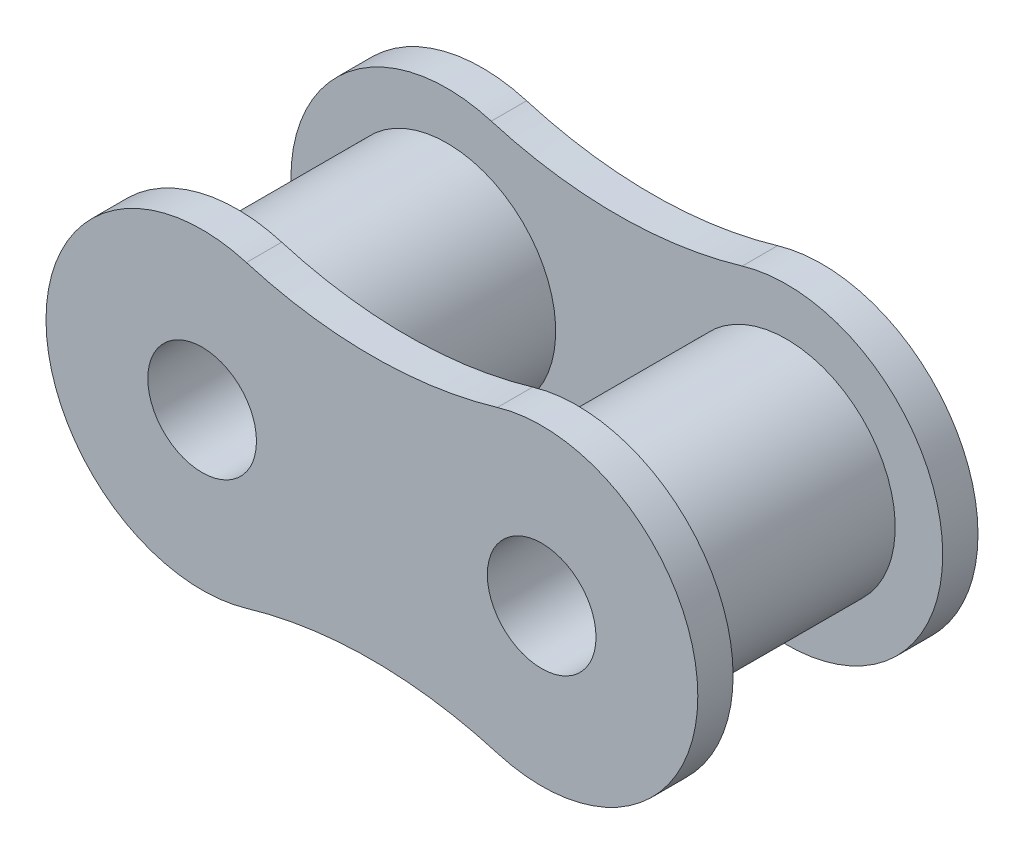
ISO-10303-21;
HEADER;
FILE_DESCRIPTION(('STEP AP214'),'2;1');
FILE_NAME('part.step','',(''),(''),'','','');
FILE_SCHEMA(('AUTOMOTIVE_DESIGN { 1 0 10303 214 1 1 1 1 }'));
ENDSEC;
DATA;
#1=APPLICATION_CONTEXT('core data for automotive mechanical design processes');
#2=APPLICATION_PROTOCOL_DEFINITION('international standard','automotive_design',2000,#1);
#3=PRODUCT_CONTEXT('',#1,'mechanical');
#4=PRODUCT('Part','Part','',(#3));
#5=PRODUCT_RELATED_PRODUCT_CATEGORY('part','',(#4));
#6=PRODUCT_DEFINITION_FORMATION('','',#4);
#7=PRODUCT_DEFINITION_CONTEXT('part definition',#1,'design');
#8=PRODUCT_DEFINITION('design','',#6,#7);
#9=PRODUCT_DEFINITION_SHAPE('','',#8);
#10=(LENGTH_UNIT() NAMED_UNIT(*) SI_UNIT(.MILLI.,.METRE.));
#11=(NAMED_UNIT(*) PLANE_ANGLE_UNIT() SI_UNIT($,.RADIAN.));
#12=(NAMED_UNIT(*) SI_UNIT($,.STERADIAN.) SOLID_ANGLE_UNIT());
#13=UNCERTAINTY_MEASURE_WITH_UNIT(LENGTH_MEASURE(1.E-05),#10,'distance_accuracy_value','');
#14=(GEOMETRIC_REPRESENTATION_CONTEXT(3) GLOBAL_UNCERTAINTY_ASSIGNED_CONTEXT((#13)) GLOBAL_UNIT_ASSIGNED_CONTEXT((#10,
#11,#12)) REPRESENTATION_CONTEXT('',''));
#15=CARTESIAN_POINT('',(0.,0.,0.));
#16=DIRECTION('',(0.,0.,1.));
#17=DIRECTION('',(1.,0.,0.));
#18=AXIS2_PLACEMENT_3D('',#15,#16,#17);
#19=CARTESIAN_POINT('',(-3.96875,13.4204712449861,4.9));
#20=DIRECTION('',(0.,0.,1.));
#21=DIRECTION('',(1.,0.,0.));
#22=AXIS2_PLACEMENT_3D('',#19,#20,#21);
#23=PLANE('',#22);
#24=CARTESIAN_POINT('',(0.,0.,4.9));
#25=DIRECTION('',(0.,0.,1.));
#26=DIRECTION('',(1.,0.,0.));
#27=AXIS2_PLACEMENT_3D('',#24,#25,#26);
#28=CIRCLE('',#27,5.08);
#29=CARTESIAN_POINT('',(5.08,0.,4.9));
#30=VERTEX_POINT('',#29);
#31=EDGE_CURVE('E41',#30,#30,#28,.T.);
#32=ORIENTED_EDGE('',*,*,#31,.T.);
#33=EDGE_LOOP('',(#32));
#34=FACE_BOUND('',#33,.T.);
#35=CARTESIAN_POINT('',(-7.9375,26.8409424899723,4.9));
#36=DIRECTION('',(0.,0.,-1.));
#37=DIRECTION('',(1.,0.,0.));
#38=AXIS2_PLACEMENT_3D('',#35,#36,#37);
#39=CIRCLE('',#38,20.69);
#40=CARTESIAN_POINT('',(-2.07015898535191,7.00031726247938,4.9));
#41=VERTEX_POINT('',#40);
#42=CARTESIAN_POINT('',(-13.8048410146481,7.00031726247938,4.9));
#43=VERTEX_POINT('',#42);
#44=EDGE_CURVE('E151',#41,#43,#39,.T.);
#45=ORIENTED_EDGE('',*,*,#44,.F.);
#46=CARTESIAN_POINT('',(0.,0.,4.9));
#47=DIRECTION('',(0.,0.,1.));
#48=DIRECTION('',(1.,0.,0.));
#49=AXIS2_PLACEMENT_3D('',#46,#47,#48);
#50=CIRCLE('',#49,7.3);
#51=CARTESIAN_POINT('',(-2.07015898535191,-7.00031726247938,4.9));
#52=VERTEX_POINT('',#51);
#53=EDGE_CURVE('E73',#52,#41,#50,.T.);
#54=ORIENTED_EDGE('',*,*,#53,.F.);
#55=CARTESIAN_POINT('',(-7.9375,-26.8409424899723,4.9));
#56=DIRECTION('',(0.,0.,-1.));
#57=DIRECTION('',(-1.,0.,0.));
#58=AXIS2_PLACEMENT_3D('',#55,#56,#57);
#59=CIRCLE('',#58,20.69);
#60=CARTESIAN_POINT('',(-13.8048410146481,-7.00031726247938,4.9));
#61=VERTEX_POINT('',#60);
#62=EDGE_CURVE('E67',#61,#52,#59,.T.);
#63=ORIENTED_EDGE('',*,*,#62,.F.);
#64=CARTESIAN_POINT('',(-15.875,0.,4.9));
#65=DIRECTION('',(0.,0.,1.));
#66=DIRECTION('',(1.,0.,0.));
#67=AXIS2_PLACEMENT_3D('',#64,#65,#66);
#68=CIRCLE('',#67,7.3);
#69=EDGE_CURVE('E161',#43,#61,#68,.T.);
#70=ORIENTED_EDGE('',*,*,#69,.F.);
#71=EDGE_LOOP('',(#45,#54,#63,#70));
#72=FACE_BOUND('',#71,.T.);
#73=CARTESIAN_POINT('',(-15.875,0.,4.9));
#74=DIRECTION('',(0.,0.,1.));
#75=DIRECTION('',(1.,0.,0.));
#76=AXIS2_PLACEMENT_3D('',#73,#74,#75);
#77=CIRCLE('',#76,5.08);
#78=CARTESIAN_POINT('',(-10.795,0.,4.9));
#79=VERTEX_POINT('',#78);
#80=EDGE_CURVE('E11',#79,#79,#77,.F.);
#81=ORIENTED_EDGE('',*,*,#80,.F.);
#82=EDGE_LOOP('',(#81));
#83=FACE_BOUND('',#82,.T.);
#84=ADVANCED_FACE('F32',(#34,#72,#83),#23,.F.);
#85=CARTESIAN_POINT('',(0.,0.,4.9));
#86=DIRECTION('',(0.,0.,-1.));
#87=DIRECTION('',(-1.,0.,0.));
#88=AXIS2_PLACEMENT_3D('',#85,#86,#87);
#89=CYLINDRICAL_SURFACE('',#88,5.08);
#90=ORIENTED_EDGE('',*,*,#31,.F.);
#91=EDGE_LOOP('',(#90));
#92=FACE_BOUND('',#91,.T.);
#93=CARTESIAN_POINT('',(0.,0.,-4.9));
#94=DIRECTION('',(0.,0.,-1.));
#95=DIRECTION('',(-1.,0.,0.));
#96=AXIS2_PLACEMENT_3D('',#93,#94,#95);
#97=CIRCLE('',#96,5.08);
#98=CARTESIAN_POINT('',(-5.08,0.,-4.9));
#99=VERTEX_POINT('',#98);
#100=EDGE_CURVE('E137',#99,#99,#97,.T.);
#101=ORIENTED_EDGE('',*,*,#100,.F.);
#102=EDGE_LOOP('',(#101));
#103=FACE_BOUND('',#102,.T.);
#104=ADVANCED_FACE('F34',(#92,#103),#89,.T.);
#105=CARTESIAN_POINT('',(0.,0.,4.9));
#106=DIRECTION('',(0.,0.,-1.));
#107=DIRECTION('',(-1.,0.,0.));
#108=AXIS2_PLACEMENT_3D('',#105,#106,#107);
#109=CYLINDRICAL_SURFACE('',#108,2.54);
#110=CARTESIAN_POINT('',(0.,0.,6.55));
#111=DIRECTION('',(0.,0.,1.));
#112=DIRECTION('',(1.,0.,0.));
#113=AXIS2_PLACEMENT_3D('',#110,#111,#112);
#114=CIRCLE('',#113,2.54);
#115=CARTESIAN_POINT('',(2.54,0.,6.55));
#116=VERTEX_POINT('',#115);
#117=EDGE_CURVE('E148',#116,#116,#114,.T.);
#118=ORIENTED_EDGE('',*,*,#117,.T.);
#119=EDGE_LOOP('',(#118));
#120=FACE_BOUND('',#119,.T.);
#121=CARTESIAN_POINT('',(0.,0.,-6.55));
#122=DIRECTION('',(0.,0.,-1.));
#123=DIRECTION('',(-1.,0.,0.));
#124=AXIS2_PLACEMENT_3D('',#121,#122,#123);
#125=CIRCLE('',#124,2.54);
#126=CARTESIAN_POINT('',(-2.54,0.,-6.55));
#127=VERTEX_POINT('',#126);
#128=EDGE_CURVE('E227',#127,#127,#125,.T.);
#129=ORIENTED_EDGE('',*,*,#128,.T.);
#130=EDGE_LOOP('',(#129));
#131=FACE_BOUND('',#130,.T.);
#132=ADVANCED_FACE('F178',(#120,#131),#109,.F.);
#133=CARTESIAN_POINT('',(-3.96875,13.4204712449861,6.55));
#134=DIRECTION('',(0.,0.,1.));
#135=DIRECTION('',(1.,0.,0.));
#136=AXIS2_PLACEMENT_3D('',#133,#134,#135);
#137=PLANE('',#136);
#138=ORIENTED_EDGE('',*,*,#117,.F.);
#139=EDGE_LOOP('',(#138));
#140=FACE_BOUND('',#139,.T.);
#141=CARTESIAN_POINT('',(-7.9375,26.8409424899723,6.55));
#142=DIRECTION('',(0.,0.,-1.));
#143=DIRECTION('',(1.,0.,0.));
#144=AXIS2_PLACEMENT_3D('',#141,#142,#143);
#145=CIRCLE('',#144,20.69);
#146=CARTESIAN_POINT('',(-2.07015898535191,7.00031726247938,6.55));
#147=VERTEX_POINT('',#146);
#148=CARTESIAN_POINT('',(-13.8048410146481,7.00031726247938,6.55));
#149=VERTEX_POINT('',#148);
#150=EDGE_CURVE('E152',#147,#149,#145,.T.);
#151=ORIENTED_EDGE('',*,*,#150,.T.);
#152=CARTESIAN_POINT('',(-15.875,0.,6.55));
#153=DIRECTION('',(0.,0.,1.));
#154=DIRECTION('',(1.,0.,0.));
#155=AXIS2_PLACEMENT_3D('',#152,#153,#154);
#156=CIRCLE('',#155,7.3);
#157=CARTESIAN_POINT('',(-13.8048410146481,-7.00031726247938,6.55));
#158=VERTEX_POINT('',#157);
#159=EDGE_CURVE('E81',#149,#158,#156,.T.);
#160=ORIENTED_EDGE('',*,*,#159,.T.);
#161=CARTESIAN_POINT('',(-7.9375,-26.8409424899723,6.55));
#162=DIRECTION('',(0.,0.,-1.));
#163=DIRECTION('',(-1.,0.,0.));
#164=AXIS2_PLACEMENT_3D('',#161,#162,#163);
#165=CIRCLE('',#164,20.69);
#166=CARTESIAN_POINT('',(-2.07015898535191,-7.00031726247938,6.55));
#167=VERTEX_POINT('',#166);
#168=EDGE_CURVE('E155',#158,#167,#165,.T.);
#169=ORIENTED_EDGE('',*,*,#168,.T.);
#170=CARTESIAN_POINT('',(0.,0.,6.55));
#171=DIRECTION('',(0.,0.,1.));
#172=DIRECTION('',(1.,0.,0.));
#173=AXIS2_PLACEMENT_3D('',#170,#171,#172);
#174=CIRCLE('',#173,7.3);
#175=EDGE_CURVE('E49',#167,#147,#174,.T.);
#176=ORIENTED_EDGE('',*,*,#175,.T.);
#177=EDGE_LOOP('',(#151,#160,#169,#176));
#178=FACE_BOUND('',#177,.T.);
#179=CARTESIAN_POINT('',(-15.875,0.,6.55));
#180=DIRECTION('',(0.,0.,1.));
#181=DIRECTION('',(1.,0.,0.));
#182=AXIS2_PLACEMENT_3D('',#179,#180,#181);
#183=CIRCLE('',#182,2.54);
#184=CARTESIAN_POINT('',(-13.335,0.,6.55));
#185=VERTEX_POINT('',#184);
#186=EDGE_CURVE('E145',#185,#185,#183,.T.);
#187=ORIENTED_EDGE('',*,*,#186,.F.);
#188=EDGE_LOOP('',(#187));
#189=FACE_BOUND('',#188,.T.);
#190=ADVANCED_FACE('F203',(#140,#178,#189),#137,.T.);
#191=CARTESIAN_POINT('',(-7.9375,26.8409424899723,6.55));
#192=DIRECTION('',(0.,0.,-1.));
#193=DIRECTION('',(-1.,0.,0.));
#194=AXIS2_PLACEMENT_3D('',#191,#192,#193);
#195=CYLINDRICAL_SURFACE('',#194,20.69);
#196=ORIENTED_EDGE('',*,*,#44,.T.);
#197=DIRECTION('',(0.,0.,-1.));
#198=VECTOR('',#197,1.);
#199=CARTESIAN_POINT('',(-13.8048410146481,7.00031726247938,6.55));
#200=LINE('',#199,#198);
#201=EDGE_CURVE('E170',#149,#43,#200,.T.);
#202=ORIENTED_EDGE('',*,*,#201,.F.);
#203=ORIENTED_EDGE('',*,*,#150,.F.);
#204=DIRECTION('',(0.,0.,-1.));
#205=VECTOR('',#204,1.);
#206=CARTESIAN_POINT('',(-2.07015898535191,7.00031726247938,6.55));
#207=LINE('',#206,#205);
#208=EDGE_CURVE('E158',#147,#41,#207,.T.);
#209=ORIENTED_EDGE('',*,*,#208,.T.);
#210=EDGE_LOOP('',(#196,#202,#203,#209));
#211=FACE_BOUND('',#210,.T.);
#212=ADVANCED_FACE('F214',(#211),#195,.F.);
#213=CARTESIAN_POINT('',(-15.875,0.,6.55));
#214=DIRECTION('',(0.,0.,-1.));
#215=DIRECTION('',(-1.,0.,0.));
#216=AXIS2_PLACEMENT_3D('',#213,#214,#215);
#217=CYLINDRICAL_SURFACE('',#216,7.3);
#218=ORIENTED_EDGE('',*,*,#69,.T.);
#219=DIRECTION('',(0.,0.,-1.));
#220=VECTOR('',#219,1.);
#221=CARTESIAN_POINT('',(-13.8048410146481,-7.00031726247938,6.55));
#222=LINE('',#221,#220);
#223=EDGE_CURVE('E168',#158,#61,#222,.T.);
#224=ORIENTED_EDGE('',*,*,#223,.F.);
#225=ORIENTED_EDGE('',*,*,#159,.F.);
#226=ORIENTED_EDGE('',*,*,#201,.T.);
#227=EDGE_LOOP('',(#218,#224,#225,#226));
#228=FACE_BOUND('',#227,.T.);
#229=ADVANCED_FACE('F211',(#228),#217,.T.);
#230=CARTESIAN_POINT('',(-7.9375,-26.8409424899723,6.55));
#231=DIRECTION('',(0.,0.,-1.));
#232=DIRECTION('',(-1.,0.,0.));
#233=AXIS2_PLACEMENT_3D('',#230,#231,#232);
#234=CYLINDRICAL_SURFACE('',#233,20.69);
#235=ORIENTED_EDGE('',*,*,#62,.T.);
#236=DIRECTION('',(0.,0.,-1.));
#237=VECTOR('',#236,1.);
#238=CARTESIAN_POINT('',(-2.07015898535191,-7.00031726247938,6.55));
#239=LINE('',#238,#237);
#240=EDGE_CURVE('E166',#167,#52,#239,.T.);
#241=ORIENTED_EDGE('',*,*,#240,.F.);
#242=ORIENTED_EDGE('',*,*,#168,.F.);
#243=ORIENTED_EDGE('',*,*,#223,.T.);
#244=EDGE_LOOP('',(#235,#241,#242,#243));
#245=FACE_BOUND('',#244,.T.);
#246=ADVANCED_FACE('F208',(#245),#234,.F.);
#247=CARTESIAN_POINT('',(0.,0.,6.55));
#248=DIRECTION('',(0.,0.,-1.));
#249=DIRECTION('',(-1.,0.,0.));
#250=AXIS2_PLACEMENT_3D('',#247,#248,#249);
#251=CYLINDRICAL_SURFACE('',#250,7.3);
#252=ORIENTED_EDGE('',*,*,#53,.T.);
#253=ORIENTED_EDGE('',*,*,#208,.F.);
#254=ORIENTED_EDGE('',*,*,#175,.F.);
#255=ORIENTED_EDGE('',*,*,#240,.T.);
#256=EDGE_LOOP('',(#252,#253,#254,#255));
#257=FACE_BOUND('',#256,.T.);
#258=ADVANCED_FACE('F205',(#257),#251,.T.);
#259=CARTESIAN_POINT('',(-15.875,0.,6.55));
#260=DIRECTION('',(0.,0.,-1.));
#261=DIRECTION('',(-1.,0.,0.));
#262=AXIS2_PLACEMENT_3D('',#259,#260,#261);
#263=CYLINDRICAL_SURFACE('',#262,2.54);
#264=ORIENTED_EDGE('',*,*,#186,.T.);
#265=EDGE_LOOP('',(#264));
#266=FACE_BOUND('',#265,.T.);
#267=CARTESIAN_POINT('',(-15.875,0.,-6.55));
#268=DIRECTION('',(0.,0.,-1.));
#269=DIRECTION('',(-1.,0.,0.));
#270=AXIS2_PLACEMENT_3D('',#267,#268,#269);
#271=CIRCLE('',#270,2.54);
#272=CARTESIAN_POINT('',(-18.415,0.,-6.55));
#273=VERTEX_POINT('',#272);
#274=EDGE_CURVE('E228',#273,#273,#271,.T.);
#275=ORIENTED_EDGE('',*,*,#274,.T.);
#276=EDGE_LOOP('',(#275));
#277=FACE_BOUND('',#276,.T.);
#278=ADVANCED_FACE('F192',(#266,#277),#263,.F.);
#279=CARTESIAN_POINT('',(-15.875,0.,4.9));
#280=DIRECTION('',(0.,0.,-1.));
#281=DIRECTION('',(-1.,0.,0.));
#282=AXIS2_PLACEMENT_3D('',#279,#280,#281);
#283=CYLINDRICAL_SURFACE('',#282,5.08);
#284=ORIENTED_EDGE('',*,*,#80,.T.);
#285=EDGE_LOOP('',(#284));
#286=FACE_BOUND('',#285,.T.);
#287=CARTESIAN_POINT('',(-15.875,0.,-4.9));
#288=DIRECTION('',(0.,0.,-1.));
#289=DIRECTION('',(-1.,0.,0.));
#290=AXIS2_PLACEMENT_3D('',#287,#288,#289);
#291=CIRCLE('',#290,5.08);
#292=CARTESIAN_POINT('',(-20.955,0.,-4.9));
#293=VERTEX_POINT('',#292);
#294=EDGE_CURVE('E134',#293,#293,#291,.T.);
#295=ORIENTED_EDGE('',*,*,#294,.F.);
#296=EDGE_LOOP('',(#295));
#297=FACE_BOUND('',#296,.T.);
#298=ADVANCED_FACE('F183',(#286,#297),#283,.T.);
#299=CARTESIAN_POINT('',(-11.90625,13.4204712449861,-4.9));
#300=DIRECTION('',(0.,0.,-1.));
#301=DIRECTION('',(-1.,0.,0.));
#302=AXIS2_PLACEMENT_3D('',#299,#300,#301);
#303=PLANE('',#302);
#304=ORIENTED_EDGE('',*,*,#294,.T.);
#305=EDGE_LOOP('',(#304));
#306=FACE_BOUND('',#305,.T.);
#307=CARTESIAN_POINT('',(-7.9375,26.8409424899722,-4.9));
#308=DIRECTION('',(0.,0.,1.));
#309=DIRECTION('',(-1.,0.,0.));
#310=AXIS2_PLACEMENT_3D('',#307,#308,#309);
#311=CIRCLE('',#310,20.6899999999999);
#312=CARTESIAN_POINT('',(-13.8048410146481,7.00031726247938,-4.9));
#313=VERTEX_POINT('',#312);
#314=CARTESIAN_POINT('',(-2.07015898535191,7.00031726247938,-4.9));
#315=VERTEX_POINT('',#314);
#316=EDGE_CURVE('E133',#313,#315,#311,.T.);
#317=ORIENTED_EDGE('',*,*,#316,.F.);
#318=CARTESIAN_POINT('',(-15.875,0.,-4.9));
#319=DIRECTION('',(0.,0.,-1.));
#320=DIRECTION('',(-1.,0.,0.));
#321=AXIS2_PLACEMENT_3D('',#318,#319,#320);
#322=CIRCLE('',#321,7.3);
#323=CARTESIAN_POINT('',(-13.8048410146481,-7.00031726247938,-4.9));
#324=VERTEX_POINT('',#323);
#325=EDGE_CURVE('E129',#324,#313,#322,.T.);
#326=ORIENTED_EDGE('',*,*,#325,.F.);
#327=CARTESIAN_POINT('',(-7.93749999999999,-26.8409424899722,-4.9));
#328=DIRECTION('',(0.,0.,1.));
#329=DIRECTION('',(1.,0.,0.));
#330=AXIS2_PLACEMENT_3D('',#327,#328,#329);
#331=CIRCLE('',#330,20.6899999999999);
#332=CARTESIAN_POINT('',(-2.07015898535191,-7.00031726247938,-4.9));
#333=VERTEX_POINT('',#332);
#334=EDGE_CURVE('E239',#333,#324,#331,.T.);
#335=ORIENTED_EDGE('',*,*,#334,.F.);
#336=CARTESIAN_POINT('',(0.,0.,-4.9));
#337=DIRECTION('',(0.,0.,-1.));
#338=DIRECTION('',(-1.,0.,0.));
#339=AXIS2_PLACEMENT_3D('',#336,#337,#338);
#340=CIRCLE('',#339,7.3);
#341=EDGE_CURVE('E230',#315,#333,#340,.T.);
#342=ORIENTED_EDGE('',*,*,#341,.F.);
#343=EDGE_LOOP('',(#317,#326,#335,#342));
#344=FACE_BOUND('',#343,.T.);
#345=ORIENTED_EDGE('',*,*,#100,.T.);
#346=EDGE_LOOP('',(#345));
#347=FACE_BOUND('',#346,.T.);
#348=ADVANCED_FACE('F181',(#306,#344,#347),#303,.F.);
#349=CARTESIAN_POINT('',(-11.90625,13.4204712449861,-6.55));
#350=DIRECTION('',(0.,0.,-1.));
#351=DIRECTION('',(-1.,0.,0.));
#352=AXIS2_PLACEMENT_3D('',#349,#350,#351);
#353=PLANE('',#352);
#354=ORIENTED_EDGE('',*,*,#128,.F.);
#355=EDGE_LOOP('',(#354));
#356=FACE_BOUND('',#355,.T.);
#357=CARTESIAN_POINT('',(-7.9375,26.8409424899722,-6.55));
#358=DIRECTION('',(0.,0.,1.));
#359=DIRECTION('',(-1.,0.,0.));
#360=AXIS2_PLACEMENT_3D('',#357,#358,#359);
#361=CIRCLE('',#360,20.6899999999999);
#362=CARTESIAN_POINT('',(-13.8048410146481,7.00031726247938,-6.55));
#363=VERTEX_POINT('',#362);
#364=CARTESIAN_POINT('',(-2.07015898535191,7.00031726247938,-6.55));
#365=VERTEX_POINT('',#364);
#366=EDGE_CURVE('E119',#363,#365,#361,.T.);
#367=ORIENTED_EDGE('',*,*,#366,.T.);
#368=CARTESIAN_POINT('',(0.,0.,-6.55));
#369=DIRECTION('',(0.,0.,-1.));
#370=DIRECTION('',(-1.,0.,0.));
#371=AXIS2_PLACEMENT_3D('',#368,#369,#370);
#372=CIRCLE('',#371,7.3);
#373=CARTESIAN_POINT('',(-2.07015898535191,-7.00031726247938,-6.55));
#374=VERTEX_POINT('',#373);
#375=EDGE_CURVE('E108',#365,#374,#372,.T.);
#376=ORIENTED_EDGE('',*,*,#375,.T.);
#377=CARTESIAN_POINT('',(-7.93749999999999,-26.8409424899722,-6.55));
#378=DIRECTION('',(0.,0.,1.));
#379=DIRECTION('',(1.,0.,0.));
#380=AXIS2_PLACEMENT_3D('',#377,#378,#379);
#381=CIRCLE('',#380,20.6899999999999);
#382=CARTESIAN_POINT('',(-13.8048410146481,-7.00031726247938,-6.55));
#383=VERTEX_POINT('',#382);
#384=EDGE_CURVE('E118',#374,#383,#381,.T.);
#385=ORIENTED_EDGE('',*,*,#384,.T.);
#386=CARTESIAN_POINT('',(-15.875,0.,-6.55));
#387=DIRECTION('',(0.,0.,-1.));
#388=DIRECTION('',(-1.,0.,0.));
#389=AXIS2_PLACEMENT_3D('',#386,#387,#388);
#390=CIRCLE('',#389,7.3);
#391=EDGE_CURVE('E125',#383,#363,#390,.T.);
#392=ORIENTED_EDGE('',*,*,#391,.T.);
#393=EDGE_LOOP('',(#367,#376,#385,#392));
#394=FACE_BOUND('',#393,.T.);
#395=ORIENTED_EDGE('',*,*,#274,.F.);
#396=EDGE_LOOP('',(#395));
#397=FACE_BOUND('',#396,.T.);
#398=ADVANCED_FACE('F122',(#356,#394,#397),#353,.T.);
#399=CARTESIAN_POINT('',(-7.9375,26.8409424899722,-6.55));
#400=DIRECTION('',(0.,0.,1.));
#401=DIRECTION('',(1.,0.,0.));
#402=AXIS2_PLACEMENT_3D('',#399,#400,#401);
#403=CYLINDRICAL_SURFACE('',#402,20.6899999999999);
#404=ORIENTED_EDGE('',*,*,#316,.T.);
#405=DIRECTION('',(0.,0.,1.));
#406=VECTOR('',#405,1.);
#407=CARTESIAN_POINT('',(-2.07015898535191,7.00031726247938,-6.55));
#408=LINE('',#407,#406);
#409=EDGE_CURVE('E112',#365,#315,#408,.T.);
#410=ORIENTED_EDGE('',*,*,#409,.F.);
#411=ORIENTED_EDGE('',*,*,#366,.F.);
#412=DIRECTION('',(0.,0.,1.));
#413=VECTOR('',#412,1.);
#414=CARTESIAN_POINT('',(-13.8048410146481,7.00031726247938,-6.55));
#415=LINE('',#414,#413);
#416=EDGE_CURVE('E236',#363,#313,#415,.T.);
#417=ORIENTED_EDGE('',*,*,#416,.T.);
#418=EDGE_LOOP('',(#404,#410,#411,#417));
#419=FACE_BOUND('',#418,.T.);
#420=ADVANCED_FACE('F131',(#419),#403,.F.);
#421=CARTESIAN_POINT('',(0.,0.,-6.55));
#422=DIRECTION('',(0.,0.,1.));
#423=DIRECTION('',(1.,0.,0.));
#424=AXIS2_PLACEMENT_3D('',#421,#422,#423);
#425=CYLINDRICAL_SURFACE('',#424,7.3);
#426=ORIENTED_EDGE('',*,*,#341,.T.);
#427=DIRECTION('',(0.,0.,1.));
#428=VECTOR('',#427,1.);
#429=CARTESIAN_POINT('',(-2.07015898535191,-7.00031726247938,-6.55));
#430=LINE('',#429,#428);
#431=EDGE_CURVE('E115',#374,#333,#430,.T.);
#432=ORIENTED_EDGE('',*,*,#431,.F.);
#433=ORIENTED_EDGE('',*,*,#375,.F.);
#434=ORIENTED_EDGE('',*,*,#409,.T.);
#435=EDGE_LOOP('',(#426,#432,#433,#434));
#436=FACE_BOUND('',#435,.T.);
#437=ADVANCED_FACE('F110',(#436),#425,.T.);
#438=CARTESIAN_POINT('',(-7.93749999999999,-26.8409424899722,-6.55));
#439=DIRECTION('',(0.,0.,1.));
#440=DIRECTION('',(1.,0.,0.));
#441=AXIS2_PLACEMENT_3D('',#438,#439,#440);
#442=CYLINDRICAL_SURFACE('',#441,20.6899999999999);
#443=ORIENTED_EDGE('',*,*,#334,.T.);
#444=DIRECTION('',(0.,0.,1.));
#445=VECTOR('',#444,1.);
#446=CARTESIAN_POINT('',(-13.8048410146481,-7.00031726247938,-6.55));
#447=LINE('',#446,#445);
#448=EDGE_CURVE('E139',#383,#324,#447,.T.);
#449=ORIENTED_EDGE('',*,*,#448,.F.);
#450=ORIENTED_EDGE('',*,*,#384,.F.);
#451=ORIENTED_EDGE('',*,*,#431,.T.);
#452=EDGE_LOOP('',(#443,#449,#450,#451));
#453=FACE_BOUND('',#452,.T.);
#454=ADVANCED_FACE('F249',(#453),#442,.F.);
#455=CARTESIAN_POINT('',(-15.875,0.,-6.55));
#456=DIRECTION('',(0.,0.,1.));
#457=DIRECTION('',(1.,0.,0.));
#458=AXIS2_PLACEMENT_3D('',#455,#456,#457);
#459=CYLINDRICAL_SURFACE('',#458,7.3);
#460=ORIENTED_EDGE('',*,*,#325,.T.);
#461=ORIENTED_EDGE('',*,*,#416,.F.);
#462=ORIENTED_EDGE('',*,*,#391,.F.);
#463=ORIENTED_EDGE('',*,*,#448,.T.);
#464=EDGE_LOOP('',(#460,#461,#462,#463));
#465=FACE_BOUND('',#464,.T.);
#466=ADVANCED_FACE('F246',(#465),#459,.T.);
#467=CLOSED_SHELL('',(#84,#104,#132,#190,#212,#229,#246,#258,#278,#298,#348,#398,#420,#437,#454,#466));
#468=MANIFOLD_SOLID_BREP('B2',#467);
#469=ADVANCED_BREP_SHAPE_REPRESENTATION('',(#18,#468),#14);
#470=SHAPE_DEFINITION_REPRESENTATION(#9,#469);
ENDSEC;
END-ISO-10303-21;
